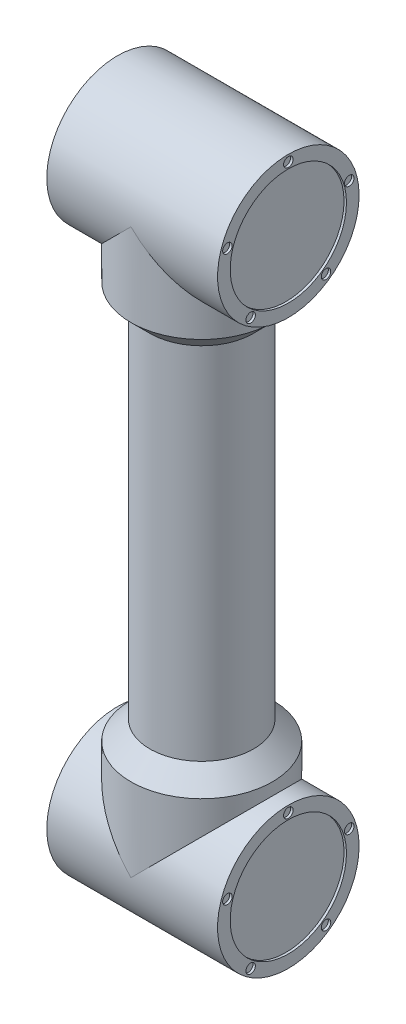
ISO-10303-21;
HEADER;
FILE_DESCRIPTION(('STEP AP214'),'2;1');
FILE_NAME('part.step','',(''),(''),'','','');
FILE_SCHEMA(('AUTOMOTIVE_DESIGN { 1 0 10303 214 1 1 1 1 }'));
ENDSEC;
DATA;
#1=APPLICATION_CONTEXT('core data for automotive mechanical design processes');
#2=APPLICATION_PROTOCOL_DEFINITION('international standard','automotive_design',2000,#1);
#3=PRODUCT_CONTEXT('',#1,'mechanical');
#4=PRODUCT('Part','Part','',(#3));
#5=PRODUCT_RELATED_PRODUCT_CATEGORY('part','',(#4));
#6=PRODUCT_DEFINITION_FORMATION('','',#4);
#7=PRODUCT_DEFINITION_CONTEXT('part definition',#1,'design');
#8=PRODUCT_DEFINITION('design','',#6,#7);
#9=PRODUCT_DEFINITION_SHAPE('','',#8);
#10=(LENGTH_UNIT() NAMED_UNIT(*) SI_UNIT(.MILLI.,.METRE.));
#11=(NAMED_UNIT(*) PLANE_ANGLE_UNIT() SI_UNIT($,.RADIAN.));
#12=(NAMED_UNIT(*) SI_UNIT($,.STERADIAN.) SOLID_ANGLE_UNIT());
#13=UNCERTAINTY_MEASURE_WITH_UNIT(LENGTH_MEASURE(1.E-05),#10,'distance_accuracy_value','');
#14=(GEOMETRIC_REPRESENTATION_CONTEXT(3) GLOBAL_UNCERTAINTY_ASSIGNED_CONTEXT((#13)) GLOBAL_UNIT_ASSIGNED_CONTEXT((#10,
#11,#12)) REPRESENTATION_CONTEXT('',''));
#15=CARTESIAN_POINT('',(0.,0.,0.));
#16=DIRECTION('',(0.,0.,1.));
#17=DIRECTION('',(1.,0.,0.));
#18=AXIS2_PLACEMENT_3D('',#15,#16,#17);
#19=CARTESIAN_POINT('',(0.,462.000404576914,0.));
#20=DIRECTION('',(0.,1.,0.));
#21=DIRECTION('',(-1.,0.,0.));
#22=AXIS2_PLACEMENT_3D('',#19,#20,#21);
#23=CYLINDRICAL_SURFACE('',#22,58.);
#24=CARTESIAN_POINT('',(0.,0.,0.));
#25=DIRECTION('',(0.707106781186547,0.707106781186547,0.));
#26=DIRECTION('',(-0.707106781186547,0.707106781186547,0.));
#27=AXIS2_PLACEMENT_3D('',#24,#25,#26);
#28=ELLIPSE('',#27,82.0243866176395,58.);
#29=CARTESIAN_POINT('',(0.,0.,58.));
#30=VERTEX_POINT('',#29);
#31=CARTESIAN_POINT('',(0.,0.,-58.));
#32=VERTEX_POINT('',#31);
#33=EDGE_CURVE('E77',#30,#32,#28,.F.);
#34=ORIENTED_EDGE('',*,*,#33,.F.);
#35=CARTESIAN_POINT('',(0.,0.,0.));
#36=DIRECTION('',(-0.707106781186547,0.707106781186547,0.));
#37=DIRECTION('',(0.707106781186547,0.707106781186547,0.));
#38=AXIS2_PLACEMENT_3D('',#35,#36,#37);
#39=ELLIPSE('',#38,82.0243866176395,58.);
#40=EDGE_CURVE('E65',#32,#30,#39,.F.);
#41=ORIENTED_EDGE('',*,*,#40,.F.);
#42=EDGE_LOOP('',(#34,#41));
#43=FACE_BOUND('',#42,.T.);
#44=CARTESIAN_POINT('',(0.,68.,0.));
#45=DIRECTION('',(0.,1.,0.));
#46=DIRECTION('',(-1.,0.,0.));
#47=AXIS2_PLACEMENT_3D('',#44,#45,#46);
#48=CIRCLE('',#47,58.);
#49=CARTESIAN_POINT('',(-58.,68.,0.));
#50=VERTEX_POINT('',#49);
#51=EDGE_CURVE('E86',#50,#50,#48,.T.);
#52=ORIENTED_EDGE('',*,*,#51,.F.);
#53=EDGE_LOOP('',(#52));
#54=FACE_BOUND('',#53,.T.);
#55=ADVANCED_FACE('F51',(#43,#54),#23,.T.);
#56=CARTESIAN_POINT('',(0.,83.5793918274722,0.));
#57=DIRECTION('',(0.,-1.,0.));
#58=DIRECTION('',(1.,0.,0.));
#59=AXIS2_PLACEMENT_3D('',#56,#57,#58);
#60=CONICAL_SURFACE('',#59,42.5,0.782843684364335);
#61=ORIENTED_EDGE('',*,*,#51,.T.);
#62=EDGE_LOOP('',(#61));
#63=FACE_BOUND('',#62,.T.);
#64=CARTESIAN_POINT('',(0.,83.5793918274722,0.));
#65=DIRECTION('',(0.,1.,0.));
#66=DIRECTION('',(-1.,0.,0.));
#67=AXIS2_PLACEMENT_3D('',#64,#65,#66);
#68=CIRCLE('',#67,42.5);
#69=CARTESIAN_POINT('',(-42.5,83.5793918274722,0.));
#70=VERTEX_POINT('',#69);
#71=EDGE_CURVE('E90',#70,#70,#68,.T.);
#72=ORIENTED_EDGE('',*,*,#71,.F.);
#73=EDGE_LOOP('',(#72));
#74=FACE_BOUND('',#73,.T.);
#75=ADVANCED_FACE('F155',(#63,#74),#60,.T.);
#76=CARTESIAN_POINT('',(0.,462.000404576914,0.));
#77=DIRECTION('',(0.,1.,0.));
#78=DIRECTION('',(-1.,0.,0.));
#79=AXIS2_PLACEMENT_3D('',#76,#77,#78);
#80=CYLINDRICAL_SURFACE('',#79,42.5);
#81=ORIENTED_EDGE('',*,*,#71,.T.);
#82=EDGE_LOOP('',(#81));
#83=FACE_BOUND('',#82,.T.);
#84=CARTESIAN_POINT('',(0.,378.579391827472,0.));
#85=DIRECTION('',(0.,1.,0.));
#86=DIRECTION('',(-1.,0.,0.));
#87=AXIS2_PLACEMENT_3D('',#84,#85,#86);
#88=CIRCLE('',#87,42.5);
#89=CARTESIAN_POINT('',(-42.5,378.579391827472,0.));
#90=VERTEX_POINT('',#89);
#91=EDGE_CURVE('E210',#90,#90,#88,.T.);
#92=ORIENTED_EDGE('',*,*,#91,.F.);
#93=EDGE_LOOP('',(#92));
#94=FACE_BOUND('',#93,.T.);
#95=ADVANCED_FACE('F159',(#83,#94),#80,.T.);
#96=CARTESIAN_POINT('',(0.,394.000404576914,0.));
#97=DIRECTION('',(0.,1.,0.));
#98=DIRECTION('',(-1.,0.,0.));
#99=AXIS2_PLACEMENT_3D('',#96,#97,#98);
#100=CONICAL_SURFACE('',#99,58.,0.787952642430563);
#101=ORIENTED_EDGE('',*,*,#91,.T.);
#102=EDGE_LOOP('',(#101));
#103=FACE_BOUND('',#102,.T.);
#104=CARTESIAN_POINT('',(0.,394.000404576914,0.));
#105=DIRECTION('',(0.,1.,0.));
#106=DIRECTION('',(-1.,0.,0.));
#107=AXIS2_PLACEMENT_3D('',#104,#105,#106);
#108=CIRCLE('',#107,58.);
#109=CARTESIAN_POINT('',(-58.,394.000404576914,0.));
#110=VERTEX_POINT('',#109);
#111=EDGE_CURVE('E206',#110,#110,#108,.T.);
#112=ORIENTED_EDGE('',*,*,#111,.F.);
#113=EDGE_LOOP('',(#112));
#114=FACE_BOUND('',#113,.T.);
#115=ADVANCED_FACE('F164',(#103,#114),#100,.T.);
#116=CARTESIAN_POINT('',(0.,462.000404576914,0.));
#117=DIRECTION('',(0.,1.,0.));
#118=DIRECTION('',(-1.,0.,0.));
#119=AXIS2_PLACEMENT_3D('',#116,#117,#118);
#120=CYLINDRICAL_SURFACE('',#119,58.);
#121=CARTESIAN_POINT('',(0.,462.000404576914,0.));
#122=DIRECTION('',(0.707106781186547,0.707106781186547,0.));
#123=DIRECTION('',(-0.707106781186547,0.707106781186547,0.));
#124=AXIS2_PLACEMENT_3D('',#121,#122,#123);
#125=ELLIPSE('',#124,82.0243866176395,58.);
#126=CARTESIAN_POINT('',(0.,462.000404576914,58.));
#127=VERTEX_POINT('',#126);
#128=CARTESIAN_POINT('',(0.,462.000404576914,-58.));
#129=VERTEX_POINT('',#128);
#130=EDGE_CURVE('E197',#127,#129,#125,.T.);
#131=ORIENTED_EDGE('',*,*,#130,.F.);
#132=CARTESIAN_POINT('',(0.,462.000404576914,0.));
#133=DIRECTION('',(-0.707106781186547,0.707106781186547,0.));
#134=DIRECTION('',(0.707106781186547,0.707106781186547,0.));
#135=AXIS2_PLACEMENT_3D('',#132,#133,#134);
#136=ELLIPSE('',#135,82.0243866176395,58.);
#137=EDGE_CURVE('E72',#129,#127,#136,.T.);
#138=ORIENTED_EDGE('',*,*,#137,.F.);
#139=EDGE_LOOP('',(#131,#138));
#140=FACE_BOUND('',#139,.T.);
#141=ORIENTED_EDGE('',*,*,#111,.T.);
#142=EDGE_LOOP('',(#141));
#143=FACE_BOUND('',#142,.T.);
#144=ADVANCED_FACE('F171',(#140,#143),#120,.T.);
#145=CARTESIAN_POINT('',(-69.,462.000404576914,0.));
#146=DIRECTION('',(1.,0.,0.));
#147=DIRECTION('',(0.,0.,-1.));
#148=AXIS2_PLACEMENT_3D('',#145,#146,#147);
#149=CYLINDRICAL_SURFACE('',#148,58.);
#150=ORIENTED_EDGE('',*,*,#137,.T.);
#151=ORIENTED_EDGE('',*,*,#130,.T.);
#152=EDGE_LOOP('',(#150,#151));
#153=FACE_BOUND('',#152,.T.);
#154=CARTESIAN_POINT('',(-69.,462.000404576914,0.));
#155=DIRECTION('',(1.,0.,0.));
#156=DIRECTION('',(0.,0.,-1.));
#157=AXIS2_PLACEMENT_3D('',#154,#155,#156);
#158=CIRCLE('',#157,58.);
#159=CARTESIAN_POINT('',(-69.,462.000404576914,-58.));
#160=VERTEX_POINT('',#159);
#161=EDGE_CURVE('E190',#160,#160,#158,.T.);
#162=ORIENTED_EDGE('',*,*,#161,.T.);
#163=EDGE_LOOP('',(#162));
#164=FACE_BOUND('',#163,.T.);
#165=CARTESIAN_POINT('',(71.,462.000404576914,0.));
#166=DIRECTION('',(1.,0.,0.));
#167=DIRECTION('',(0.,0.,-1.));
#168=AXIS2_PLACEMENT_3D('',#165,#166,#167);
#169=CIRCLE('',#168,58.);
#170=CARTESIAN_POINT('',(71.,462.000404576914,-58.));
#171=VERTEX_POINT('',#170);
#172=EDGE_CURVE('E224',#171,#171,#169,.T.);
#173=ORIENTED_EDGE('',*,*,#172,.F.);
#174=EDGE_LOOP('',(#173));
#175=FACE_BOUND('',#174,.T.);
#176=ADVANCED_FACE('F175',(#153,#164,#175),#149,.T.);
#177=CARTESIAN_POINT('',(-69.,462.000404576914,0.));
#178=DIRECTION('',(1.,0.,0.));
#179=DIRECTION('',(0.,0.,-1.));
#180=AXIS2_PLACEMENT_3D('',#177,#178,#179);
#181=PLANE('',#180);
#182=ORIENTED_EDGE('',*,*,#161,.F.);
#183=EDGE_LOOP('',(#182));
#184=FACE_BOUND('',#183,.T.);
#185=ADVANCED_FACE('F177',(#184),#181,.F.);
#186=CARTESIAN_POINT('',(-69.,0.,0.));
#187=DIRECTION('',(1.,0.,0.));
#188=DIRECTION('',(0.,0.,-1.));
#189=AXIS2_PLACEMENT_3D('',#186,#187,#188);
#190=CYLINDRICAL_SURFACE('',#189,58.);
#191=ORIENTED_EDGE('',*,*,#40,.T.);
#192=ORIENTED_EDGE('',*,*,#33,.T.);
#193=EDGE_LOOP('',(#191,#192));
#194=FACE_BOUND('',#193,.T.);
#195=CARTESIAN_POINT('',(-69.,0.,0.));
#196=DIRECTION('',(1.,0.,0.));
#197=DIRECTION('',(0.,0.,-1.));
#198=AXIS2_PLACEMENT_3D('',#195,#196,#197);
#199=CIRCLE('',#198,58.);
#200=CARTESIAN_POINT('',(-69.,0.,-58.));
#201=VERTEX_POINT('',#200);
#202=EDGE_CURVE('E193',#201,#201,#199,.T.);
#203=ORIENTED_EDGE('',*,*,#202,.T.);
#204=EDGE_LOOP('',(#203));
#205=FACE_BOUND('',#204,.T.);
#206=CARTESIAN_POINT('',(71.,0.,0.));
#207=DIRECTION('',(1.,0.,0.));
#208=DIRECTION('',(0.,0.,-1.));
#209=AXIS2_PLACEMENT_3D('',#206,#207,#208);
#210=CIRCLE('',#209,58.);
#211=CARTESIAN_POINT('',(71.,0.,-58.));
#212=VERTEX_POINT('',#211);
#213=EDGE_CURVE('E200',#212,#212,#210,.T.);
#214=ORIENTED_EDGE('',*,*,#213,.F.);
#215=EDGE_LOOP('',(#214));
#216=FACE_BOUND('',#215,.T.);
#217=ADVANCED_FACE('F83',(#194,#205,#216),#190,.T.);
#218=CARTESIAN_POINT('',(-69.,0.,0.));
#219=DIRECTION('',(1.,0.,0.));
#220=DIRECTION('',(0.,0.,-1.));
#221=AXIS2_PLACEMENT_3D('',#218,#219,#220);
#222=PLANE('',#221);
#223=ORIENTED_EDGE('',*,*,#202,.F.);
#224=EDGE_LOOP('',(#223));
#225=FACE_BOUND('',#224,.T.);
#226=ADVANCED_FACE('F186',(#225),#222,.F.);
#227=CARTESIAN_POINT('',(71.,0.,0.));
#228=DIRECTION('',(1.,0.,0.));
#229=DIRECTION('',(0.,0.,-1.));
#230=AXIS2_PLACEMENT_3D('',#227,#228,#229);
#231=PLANE('',#230);
#232=CARTESIAN_POINT('',(71.,-42.4946821011368,30.8741937605418));
#233=DIRECTION('',(1.,0.,0.));
#234=DIRECTION('',(0.,0.,-1.));
#235=AXIS2_PLACEMENT_3D('',#232,#233,#234);
#236=CIRCLE('',#235,3.89568910114542);
#237=CARTESIAN_POINT('',(71.,-42.4946821011368,26.9785046593963));
#238=VERTEX_POINT('',#237);
#239=EDGE_CURVE('E257',#238,#238,#236,.T.);
#240=ORIENTED_EDGE('',*,*,#239,.F.);
#241=EDGE_LOOP('',(#240));
#242=FACE_BOUND('',#241,.T.);
#243=CARTESIAN_POINT('',(71.,16.2315242215125,-49.9554948798124));
#244=DIRECTION('',(1.,0.,0.));
#245=DIRECTION('',(0.,0.,-1.));
#246=AXIS2_PLACEMENT_3D('',#243,#244,#245);
#247=CIRCLE('',#246,3.89568910114174);
#248=CARTESIAN_POINT('',(71.,16.2315242215125,-53.8511839809541));
#249=VERTEX_POINT('',#248);
#250=EDGE_CURVE('E265',#249,#249,#247,.T.);
#251=ORIENTED_EDGE('',*,*,#250,.F.);
#252=EDGE_LOOP('',(#251));
#253=FACE_BOUND('',#252,.T.);
#254=CARTESIAN_POINT('',(71.,0.,0.));
#255=DIRECTION('',(1.,0.,0.));
#256=DIRECTION('',(0.,0.,-1.));
#257=AXIS2_PLACEMENT_3D('',#254,#255,#256);
#258=CIRCLE('',#257,47.6530130601922);
#259=CARTESIAN_POINT('',(71.,0.,-47.6530130601922));
#260=VERTEX_POINT('',#259);
#261=EDGE_CURVE('E273',#260,#260,#258,.T.);
#262=ORIENTED_EDGE('',*,*,#261,.F.);
#263=EDGE_LOOP('',(#262));
#264=FACE_BOUND('',#263,.T.);
#265=ORIENTED_EDGE('',*,*,#213,.T.);
#266=EDGE_LOOP('',(#265));
#267=FACE_BOUND('',#266,.T.);
#268=CARTESIAN_POINT('',(71.,52.5263157592486,-2.13912961120875E-12));
#269=DIRECTION('',(1.,0.,0.));
#270=DIRECTION('',(0.,0.,-1.));
#271=AXIS2_PLACEMENT_3D('',#268,#269,#270);
#272=CIRCLE('',#271,3.89568910114073);
#273=CARTESIAN_POINT('',(71.,52.5263157592486,-3.89568910114287));
#274=VERTEX_POINT('',#273);
#275=EDGE_CURVE('E269',#274,#274,#272,.T.);
#276=ORIENTED_EDGE('',*,*,#275,.F.);
#277=EDGE_LOOP('',(#276));
#278=FACE_BOUND('',#277,.T.);
#279=CARTESIAN_POINT('',(71.,-42.4946821011367,-30.8741937605464));
#280=DIRECTION('',(1.,0.,0.));
#281=DIRECTION('',(0.,0.,-1.));
#282=AXIS2_PLACEMENT_3D('',#279,#280,#281);
#283=CIRCLE('',#282,3.89568910114449);
#284=CARTESIAN_POINT('',(71.,-42.4946821011367,-34.7698828616908));
#285=VERTEX_POINT('',#284);
#286=EDGE_CURVE('E261',#285,#285,#283,.T.);
#287=ORIENTED_EDGE('',*,*,#286,.F.);
#288=EDGE_LOOP('',(#287));
#289=FACE_BOUND('',#288,.T.);
#290=CARTESIAN_POINT('',(71.,16.2315242215124,49.955494879808));
#291=DIRECTION('',(1.,0.,0.));
#292=DIRECTION('',(0.,0.,-1.));
#293=AXIS2_PLACEMENT_3D('',#290,#291,#292);
#294=CIRCLE('',#293,3.8956891011434);
#295=CARTESIAN_POINT('',(71.,16.2315242215124,46.0598057786646));
#296=VERTEX_POINT('',#295);
#297=EDGE_CURVE('E253',#296,#296,#294,.T.);
#298=ORIENTED_EDGE('',*,*,#297,.F.);
#299=EDGE_LOOP('',(#298));
#300=FACE_BOUND('',#299,.T.);
#301=ADVANCED_FACE('F280',(#242,#253,#264,#267,#278,#289,#300),#231,.T.);
#302=CARTESIAN_POINT('',(71.,0.,0.));
#303=DIRECTION('',(-1.,0.,0.));
#304=DIRECTION('',(0.,0.,1.));
#305=AXIS2_PLACEMENT_3D('',#302,#303,#304);
#306=CYLINDRICAL_SURFACE('',#305,47.6530130601922);
#307=ORIENTED_EDGE('',*,*,#261,.T.);
#308=EDGE_LOOP('',(#307));
#309=FACE_BOUND('',#308,.T.);
#310=CARTESIAN_POINT('',(69.,0.,0.));
#311=DIRECTION('',(1.,0.,0.));
#312=DIRECTION('',(0.,0.,-1.));
#313=AXIS2_PLACEMENT_3D('',#310,#311,#312);
#314=CIRCLE('',#313,47.6530130601922);
#315=CARTESIAN_POINT('',(69.,0.,-47.6530130601922));
#316=VERTEX_POINT('',#315);
#317=EDGE_CURVE('E113',#316,#316,#314,.F.);
#318=ORIENTED_EDGE('',*,*,#317,.T.);
#319=EDGE_LOOP('',(#318));
#320=FACE_BOUND('',#319,.T.);
#321=ADVANCED_FACE('F284',(#309,#320),#306,.F.);
#322=CARTESIAN_POINT('',(71.,52.5263157592486,-2.13912961120875E-12));
#323=DIRECTION('',(-1.,0.,0.));
#324=DIRECTION('',(0.,0.,1.));
#325=AXIS2_PLACEMENT_3D('',#322,#323,#324);
#326=CYLINDRICAL_SURFACE('',#325,3.89568910114073);
#327=ORIENTED_EDGE('',*,*,#275,.T.);
#328=EDGE_LOOP('',(#327));
#329=FACE_BOUND('',#328,.T.);
#330=CARTESIAN_POINT('',(69.,52.5263157592486,-2.13912961120875E-12));
#331=DIRECTION('',(1.,0.,0.));
#332=DIRECTION('',(0.,0.,-1.));
#333=AXIS2_PLACEMENT_3D('',#330,#331,#332);
#334=CIRCLE('',#333,3.89568910114073);
#335=CARTESIAN_POINT('',(69.,52.5263157592486,-3.89568910114287));
#336=VERTEX_POINT('',#335);
#337=EDGE_CURVE('E109',#336,#336,#334,.F.);
#338=ORIENTED_EDGE('',*,*,#337,.T.);
#339=EDGE_LOOP('',(#338));
#340=FACE_BOUND('',#339,.T.);
#341=ADVANCED_FACE('F326',(#329,#340),#326,.F.);
#342=CARTESIAN_POINT('',(71.,16.2315242215125,-49.9554948798124));
#343=DIRECTION('',(-1.,0.,0.));
#344=DIRECTION('',(0.,0.,1.));
#345=AXIS2_PLACEMENT_3D('',#342,#343,#344);
#346=CYLINDRICAL_SURFACE('',#345,3.89568910114174);
#347=ORIENTED_EDGE('',*,*,#250,.T.);
#348=EDGE_LOOP('',(#347));
#349=FACE_BOUND('',#348,.T.);
#350=CARTESIAN_POINT('',(69.,16.2315242215125,-49.9554948798124));
#351=DIRECTION('',(1.,0.,0.));
#352=DIRECTION('',(0.,0.,-1.));
#353=AXIS2_PLACEMENT_3D('',#350,#351,#352);
#354=CIRCLE('',#353,3.89568910114174);
#355=CARTESIAN_POINT('',(69.,16.2315242215125,-53.8511839809541));
#356=VERTEX_POINT('',#355);
#357=EDGE_CURVE('E105',#356,#356,#354,.F.);
#358=ORIENTED_EDGE('',*,*,#357,.T.);
#359=EDGE_LOOP('',(#358));
#360=FACE_BOUND('',#359,.T.);
#361=ADVANCED_FACE('F333',(#349,#360),#346,.F.);
#362=CARTESIAN_POINT('',(71.,-42.4946821011367,-30.8741937605464));
#363=DIRECTION('',(-1.,0.,0.));
#364=DIRECTION('',(0.,0.,1.));
#365=AXIS2_PLACEMENT_3D('',#362,#363,#364);
#366=CYLINDRICAL_SURFACE('',#365,3.89568910114449);
#367=ORIENTED_EDGE('',*,*,#286,.T.);
#368=EDGE_LOOP('',(#367));
#369=FACE_BOUND('',#368,.T.);
#370=CARTESIAN_POINT('',(69.,-42.4946821011367,-30.8741937605464));
#371=DIRECTION('',(1.,0.,0.));
#372=DIRECTION('',(0.,0.,-1.));
#373=AXIS2_PLACEMENT_3D('',#370,#371,#372);
#374=CIRCLE('',#373,3.89568910114449);
#375=CARTESIAN_POINT('',(69.,-42.4946821011367,-34.7698828616908));
#376=VERTEX_POINT('',#375);
#377=EDGE_CURVE('E101',#376,#376,#374,.F.);
#378=ORIENTED_EDGE('',*,*,#377,.T.);
#379=EDGE_LOOP('',(#378));
#380=FACE_BOUND('',#379,.T.);
#381=ADVANCED_FACE('F497',(#369,#380),#366,.F.);
#382=CARTESIAN_POINT('',(71.,-42.4946821011368,30.8741937605418));
#383=DIRECTION('',(-1.,0.,0.));
#384=DIRECTION('',(0.,0.,1.));
#385=AXIS2_PLACEMENT_3D('',#382,#383,#384);
#386=CYLINDRICAL_SURFACE('',#385,3.89568910114542);
#387=ORIENTED_EDGE('',*,*,#239,.T.);
#388=EDGE_LOOP('',(#387));
#389=FACE_BOUND('',#388,.T.);
#390=CARTESIAN_POINT('',(69.,-42.4946821011368,30.8741937605418));
#391=DIRECTION('',(1.,0.,0.));
#392=DIRECTION('',(0.,0.,-1.));
#393=AXIS2_PLACEMENT_3D('',#390,#391,#392);
#394=CIRCLE('',#393,3.89568910114542);
#395=CARTESIAN_POINT('',(69.,-42.4946821011368,26.9785046593963));
#396=VERTEX_POINT('',#395);
#397=EDGE_CURVE('E97',#396,#396,#394,.F.);
#398=ORIENTED_EDGE('',*,*,#397,.T.);
#399=EDGE_LOOP('',(#398));
#400=FACE_BOUND('',#399,.T.);
#401=ADVANCED_FACE('F297',(#389,#400),#386,.F.);
#402=CARTESIAN_POINT('',(71.,16.2315242215124,49.955494879808));
#403=DIRECTION('',(-1.,0.,0.));
#404=DIRECTION('',(0.,0.,1.));
#405=AXIS2_PLACEMENT_3D('',#402,#403,#404);
#406=CYLINDRICAL_SURFACE('',#405,3.8956891011434);
#407=ORIENTED_EDGE('',*,*,#297,.T.);
#408=EDGE_LOOP('',(#407));
#409=FACE_BOUND('',#408,.T.);
#410=CARTESIAN_POINT('',(69.,16.2315242215124,49.955494879808));
#411=DIRECTION('',(1.,0.,0.));
#412=DIRECTION('',(0.,0.,-1.));
#413=AXIS2_PLACEMENT_3D('',#410,#411,#412);
#414=CIRCLE('',#413,3.8956891011434);
#415=CARTESIAN_POINT('',(69.,16.2315242215124,46.0598057786646));
#416=VERTEX_POINT('',#415);
#417=EDGE_CURVE('E81',#416,#416,#414,.F.);
#418=ORIENTED_EDGE('',*,*,#417,.T.);
#419=EDGE_LOOP('',(#418));
#420=FACE_BOUND('',#419,.T.);
#421=ADVANCED_FACE('F293',(#409,#420),#406,.F.);
#422=CARTESIAN_POINT('',(69.,0.,0.));
#423=DIRECTION('',(1.,0.,0.));
#424=DIRECTION('',(0.,0.,-1.));
#425=AXIS2_PLACEMENT_3D('',#422,#423,#424);
#426=PLANE('',#425);
#427=ORIENTED_EDGE('',*,*,#417,.F.);
#428=EDGE_LOOP('',(#427));
#429=FACE_BOUND('',#428,.T.);
#430=ADVANCED_FACE('F296',(#429),#426,.T.);
#431=ORIENTED_EDGE('',*,*,#397,.F.);
#432=EDGE_LOOP('',(#431));
#433=FACE_BOUND('',#432,.T.);
#434=ADVANCED_FACE('F302',(#433),#426,.T.);
#435=ORIENTED_EDGE('',*,*,#377,.F.);
#436=EDGE_LOOP('',(#435));
#437=FACE_BOUND('',#436,.T.);
#438=ADVANCED_FACE('F307',(#437),#426,.T.);
#439=ORIENTED_EDGE('',*,*,#357,.F.);
#440=EDGE_LOOP('',(#439));
#441=FACE_BOUND('',#440,.T.);
#442=ADVANCED_FACE('F321',(#441),#426,.T.);
#443=ORIENTED_EDGE('',*,*,#337,.F.);
#444=EDGE_LOOP('',(#443));
#445=FACE_BOUND('',#444,.T.);
#446=ADVANCED_FACE('F312',(#445),#426,.T.);
#447=ORIENTED_EDGE('',*,*,#317,.F.);
#448=EDGE_LOOP('',(#447));
#449=FACE_BOUND('',#448,.T.);
#450=ADVANCED_FACE('F303',(#449),#426,.T.);
#451=CARTESIAN_POINT('',(71.,462.000404576914,0.));
#452=DIRECTION('',(1.,0.,0.));
#453=DIRECTION('',(0.,0.,-1.));
#454=AXIS2_PLACEMENT_3D('',#451,#452,#453);
#455=PLANE('',#454);
#456=CARTESIAN_POINT('',(71.,478.231928798427,49.9554948798079));
#457=DIRECTION('',(1.,0.,0.));
#458=DIRECTION('',(0.,0.,-1.));
#459=AXIS2_PLACEMENT_3D('',#456,#457,#458);
#460=CIRCLE('',#459,3.89568910114337);
#461=CARTESIAN_POINT('',(71.,478.231928798427,46.0598057786646));
#462=VERTEX_POINT('',#461);
#463=EDGE_CURVE('E245',#462,#462,#460,.T.);
#464=ORIENTED_EDGE('',*,*,#463,.F.);
#465=EDGE_LOOP('',(#464));
#466=FACE_BOUND('',#465,.T.);
#467=CARTESIAN_POINT('',(71.,419.505722475778,-30.8741937605464));
#468=DIRECTION('',(1.,0.,0.));
#469=DIRECTION('',(0.,0.,-1.));
#470=AXIS2_PLACEMENT_3D('',#467,#468,#469);
#471=CIRCLE('',#470,3.89568910114445);
#472=CARTESIAN_POINT('',(71.,419.505722475778,-34.7698828616909));
#473=VERTEX_POINT('',#472);
#474=EDGE_CURVE('E237',#473,#473,#471,.T.);
#475=ORIENTED_EDGE('',*,*,#474,.F.);
#476=EDGE_LOOP('',(#475));
#477=FACE_BOUND('',#476,.T.);
#478=CARTESIAN_POINT('',(71.,462.000404576914,0.));
#479=DIRECTION('',(1.,0.,0.));
#480=DIRECTION('',(0.,0.,-1.));
#481=AXIS2_PLACEMENT_3D('',#478,#479,#480);
#482=CIRCLE('',#481,47.6530130601922);
#483=CARTESIAN_POINT('',(71.,462.000404576914,-47.6530130601922));
#484=VERTEX_POINT('',#483);
#485=EDGE_CURVE('E227',#484,#484,#482,.T.);
#486=ORIENTED_EDGE('',*,*,#485,.F.);
#487=EDGE_LOOP('',(#486));
#488=FACE_BOUND('',#487,.T.);
#489=ORIENTED_EDGE('',*,*,#172,.T.);
#490=EDGE_LOOP('',(#489));
#491=FACE_BOUND('',#490,.T.);
#492=CARTESIAN_POINT('',(71.,514.526720336163,-2.19570834287574E-12));
#493=DIRECTION('',(1.,0.,0.));
#494=DIRECTION('',(0.,0.,-1.));
#495=AXIS2_PLACEMENT_3D('',#492,#493,#494);
#496=CIRCLE('',#495,3.89568910114072);
#497=CARTESIAN_POINT('',(71.,514.526720336163,-3.89568910114292));
#498=VERTEX_POINT('',#497);
#499=EDGE_CURVE('E231',#498,#498,#496,.T.);
#500=ORIENTED_EDGE('',*,*,#499,.F.);
#501=EDGE_LOOP('',(#500));
#502=FACE_BOUND('',#501,.T.);
#503=CARTESIAN_POINT('',(71.,419.505722475777,30.8741937605417));
#504=DIRECTION('',(1.,0.,0.));
#505=DIRECTION('',(0.,0.,-1.));
#506=AXIS2_PLACEMENT_3D('',#503,#504,#505);
#507=CIRCLE('',#506,3.89568910114542);
#508=CARTESIAN_POINT('',(71.,419.505722475777,26.9785046593963));
#509=VERTEX_POINT('',#508);
#510=EDGE_CURVE('E241',#509,#509,#507,.T.);
#511=ORIENTED_EDGE('',*,*,#510,.F.);
#512=EDGE_LOOP('',(#511));
#513=FACE_BOUND('',#512,.T.);
#514=CARTESIAN_POINT('',(71.,476.231524221513,-49.9554948798108));
#515=DIRECTION('',(1.,0.,0.));
#516=DIRECTION('',(0.,0.,-1.));
#517=AXIS2_PLACEMENT_3D('',#514,#515,#516);
#518=CIRCLE('',#517,3.89568910114172);
#519=CARTESIAN_POINT('',(71.,476.231524221513,-53.8511839809525));
#520=VERTEX_POINT('',#519);
#521=EDGE_CURVE('E249',#520,#520,#518,.T.);
#522=ORIENTED_EDGE('',*,*,#521,.F.);
#523=EDGE_LOOP('',(#522));
#524=FACE_BOUND('',#523,.T.);
#525=ADVANCED_FACE('F311',(#466,#477,#488,#491,#502,#513,#524),#455,.T.);
#526=CARTESIAN_POINT('',(71.,462.000404576914,0.));
#527=DIRECTION('',(-1.,0.,0.));
#528=DIRECTION('',(0.,0.,1.));
#529=AXIS2_PLACEMENT_3D('',#526,#527,#528);
#530=CYLINDRICAL_SURFACE('',#529,47.6530130601922);
#531=ORIENTED_EDGE('',*,*,#485,.T.);
#532=EDGE_LOOP('',(#531));
#533=FACE_BOUND('',#532,.T.);
#534=CARTESIAN_POINT('',(69.,462.000404576914,0.));
#535=DIRECTION('',(1.,0.,0.));
#536=DIRECTION('',(0.,0.,-1.));
#537=AXIS2_PLACEMENT_3D('',#534,#535,#536);
#538=CIRCLE('',#537,47.6530130601922);
#539=CARTESIAN_POINT('',(69.,462.000404576914,-47.6530130601922));
#540=VERTEX_POINT('',#539);
#541=EDGE_CURVE('E11',#540,#540,#538,.F.);
#542=ORIENTED_EDGE('',*,*,#541,.T.);
#543=EDGE_LOOP('',(#542));
#544=FACE_BOUND('',#543,.T.);
#545=ADVANCED_FACE('F317',(#533,#544),#530,.F.);
#546=CARTESIAN_POINT('',(71.,514.526720336163,-2.19570834287574E-12));
#547=DIRECTION('',(-1.,0.,0.));
#548=DIRECTION('',(0.,0.,1.));
#549=AXIS2_PLACEMENT_3D('',#546,#547,#548);
#550=CYLINDRICAL_SURFACE('',#549,3.89568910114072);
#551=ORIENTED_EDGE('',*,*,#499,.T.);
#552=EDGE_LOOP('',(#551));
#553=FACE_BOUND('',#552,.T.);
#554=CARTESIAN_POINT('',(69.,514.526720336163,-2.19570834287574E-12));
#555=DIRECTION('',(1.,0.,0.));
#556=DIRECTION('',(0.,0.,-1.));
#557=AXIS2_PLACEMENT_3D('',#554,#555,#556);
#558=CIRCLE('',#557,3.89568910114072);
#559=CARTESIAN_POINT('',(69.,514.526720336163,-3.89568910114292));
#560=VERTEX_POINT('',#559);
#561=EDGE_CURVE('E59',#560,#560,#558,.F.);
#562=ORIENTED_EDGE('',*,*,#561,.T.);
#563=EDGE_LOOP('',(#562));
#564=FACE_BOUND('',#563,.T.);
#565=ADVANCED_FACE('F136',(#553,#564),#550,.F.);
#566=CARTESIAN_POINT('',(71.,419.505722475778,-30.8741937605464));
#567=DIRECTION('',(-1.,0.,0.));
#568=DIRECTION('',(0.,0.,1.));
#569=AXIS2_PLACEMENT_3D('',#566,#567,#568);
#570=CYLINDRICAL_SURFACE('',#569,3.89568910114445);
#571=ORIENTED_EDGE('',*,*,#474,.T.);
#572=EDGE_LOOP('',(#571));
#573=FACE_BOUND('',#572,.T.);
#574=CARTESIAN_POINT('',(69.,419.505722475778,-30.8741937605464));
#575=DIRECTION('',(1.,0.,0.));
#576=DIRECTION('',(0.,0.,-1.));
#577=AXIS2_PLACEMENT_3D('',#574,#575,#576);
#578=CIRCLE('',#577,3.89568910114445);
#579=CARTESIAN_POINT('',(69.,419.505722475778,-34.7698828616909));
#580=VERTEX_POINT('',#579);
#581=EDGE_CURVE('E129',#580,#580,#578,.F.);
#582=ORIENTED_EDGE('',*,*,#581,.T.);
#583=EDGE_LOOP('',(#582));
#584=FACE_BOUND('',#583,.T.);
#585=ADVANCED_FACE('F537',(#573,#584),#570,.F.);
#586=CARTESIAN_POINT('',(71.,419.505722475777,30.8741937605417));
#587=DIRECTION('',(-1.,0.,0.));
#588=DIRECTION('',(0.,0.,1.));
#589=AXIS2_PLACEMENT_3D('',#586,#587,#588);
#590=CYLINDRICAL_SURFACE('',#589,3.89568910114542);
#591=ORIENTED_EDGE('',*,*,#510,.T.);
#592=EDGE_LOOP('',(#591));
#593=FACE_BOUND('',#592,.T.);
#594=CARTESIAN_POINT('',(69.,419.505722475777,30.8741937605417));
#595=DIRECTION('',(1.,0.,0.));
#596=DIRECTION('',(0.,0.,-1.));
#597=AXIS2_PLACEMENT_3D('',#594,#595,#596);
#598=CIRCLE('',#597,3.89568910114542);
#599=CARTESIAN_POINT('',(69.,419.505722475777,26.9785046593963));
#600=VERTEX_POINT('',#599);
#601=EDGE_CURVE('E125',#600,#600,#598,.F.);
#602=ORIENTED_EDGE('',*,*,#601,.T.);
#603=EDGE_LOOP('',(#602));
#604=FACE_BOUND('',#603,.T.);
#605=ADVANCED_FACE('F546',(#593,#604),#590,.F.);
#606=CARTESIAN_POINT('',(71.,478.231928798427,49.9554948798079));
#607=DIRECTION('',(-1.,0.,0.));
#608=DIRECTION('',(0.,0.,1.));
#609=AXIS2_PLACEMENT_3D('',#606,#607,#608);
#610=CYLINDRICAL_SURFACE('',#609,3.89568910114337);
#611=ORIENTED_EDGE('',*,*,#463,.T.);
#612=EDGE_LOOP('',(#611));
#613=FACE_BOUND('',#612,.T.);
#614=CARTESIAN_POINT('',(69.,478.231928798427,49.9554948798079));
#615=DIRECTION('',(1.,0.,0.));
#616=DIRECTION('',(0.,0.,-1.));
#617=AXIS2_PLACEMENT_3D('',#614,#615,#616);
#618=CIRCLE('',#617,3.89568910114337);
#619=CARTESIAN_POINT('',(69.,478.231928798427,46.0598057786646));
#620=VERTEX_POINT('',#619);
#621=EDGE_CURVE('E121',#620,#620,#618,.F.);
#622=ORIENTED_EDGE('',*,*,#621,.T.);
#623=EDGE_LOOP('',(#622));
#624=FACE_BOUND('',#623,.T.);
#625=ADVANCED_FACE('F555',(#613,#624),#610,.F.);
#626=CARTESIAN_POINT('',(71.,476.231524221513,-49.9554948798108));
#627=DIRECTION('',(-1.,0.,0.));
#628=DIRECTION('',(0.,0.,1.));
#629=AXIS2_PLACEMENT_3D('',#626,#627,#628);
#630=CYLINDRICAL_SURFACE('',#629,3.89568910114172);
#631=ORIENTED_EDGE('',*,*,#521,.T.);
#632=EDGE_LOOP('',(#631));
#633=FACE_BOUND('',#632,.T.);
#634=CARTESIAN_POINT('',(69.,476.231524221513,-49.9554948798108));
#635=DIRECTION('',(1.,0.,0.));
#636=DIRECTION('',(0.,0.,-1.));
#637=AXIS2_PLACEMENT_3D('',#634,#635,#636);
#638=CIRCLE('',#637,3.89568910114172);
#639=CARTESIAN_POINT('',(69.,476.231524221513,-53.8511839809525));
#640=VERTEX_POINT('',#639);
#641=EDGE_CURVE('E117',#640,#640,#638,.F.);
#642=ORIENTED_EDGE('',*,*,#641,.T.);
#643=EDGE_LOOP('',(#642));
#644=FACE_BOUND('',#643,.T.);
#645=ADVANCED_FACE('F564',(#633,#644),#630,.F.);
#646=CARTESIAN_POINT('',(69.,462.000404576914,0.));
#647=DIRECTION('',(1.,0.,0.));
#648=DIRECTION('',(0.,0.,-1.));
#649=AXIS2_PLACEMENT_3D('',#646,#647,#648);
#650=PLANE('',#649);
#651=ORIENTED_EDGE('',*,*,#641,.F.);
#652=EDGE_LOOP('',(#651));
#653=FACE_BOUND('',#652,.T.);
#654=ADVANCED_FACE('F149',(#653),#650,.T.);
#655=ORIENTED_EDGE('',*,*,#621,.F.);
#656=EDGE_LOOP('',(#655));
#657=FACE_BOUND('',#656,.T.);
#658=ADVANCED_FACE('F581',(#657),#650,.T.);
#659=ORIENTED_EDGE('',*,*,#601,.F.);
#660=EDGE_LOOP('',(#659));
#661=FACE_BOUND('',#660,.T.);
#662=ADVANCED_FACE('F150',(#661),#650,.T.);
#663=ORIENTED_EDGE('',*,*,#581,.F.);
#664=EDGE_LOOP('',(#663));
#665=FACE_BOUND('',#664,.T.);
#666=ADVANCED_FACE('F141',(#665),#650,.T.);
#667=ORIENTED_EDGE('',*,*,#561,.F.);
#668=EDGE_LOOP('',(#667));
#669=FACE_BOUND('',#668,.T.);
#670=ADVANCED_FACE('F138',(#669),#650,.T.);
#671=ORIENTED_EDGE('',*,*,#541,.F.);
#672=EDGE_LOOP('',(#671));
#673=FACE_BOUND('',#672,.T.);
#674=ADVANCED_FACE('F140',(#673),#650,.T.);
#675=CLOSED_SHELL('',(#55,#75,#95,#115,#144,#176,#185,#217,#226,#301,#321,#341,#361,#381,#401,
#421,#430,#434,#438,#442,#446,#450,#525,#545,#565,#585,#605,#625,#645,#654,#658,#662,#666,#670,#674));
#676=MANIFOLD_SOLID_BREP('B2',#675);
#677=ADVANCED_BREP_SHAPE_REPRESENTATION('',(#18,#676),#14);
#678=SHAPE_DEFINITION_REPRESENTATION(#9,#677);
ENDSEC;
END-ISO-10303-21;
